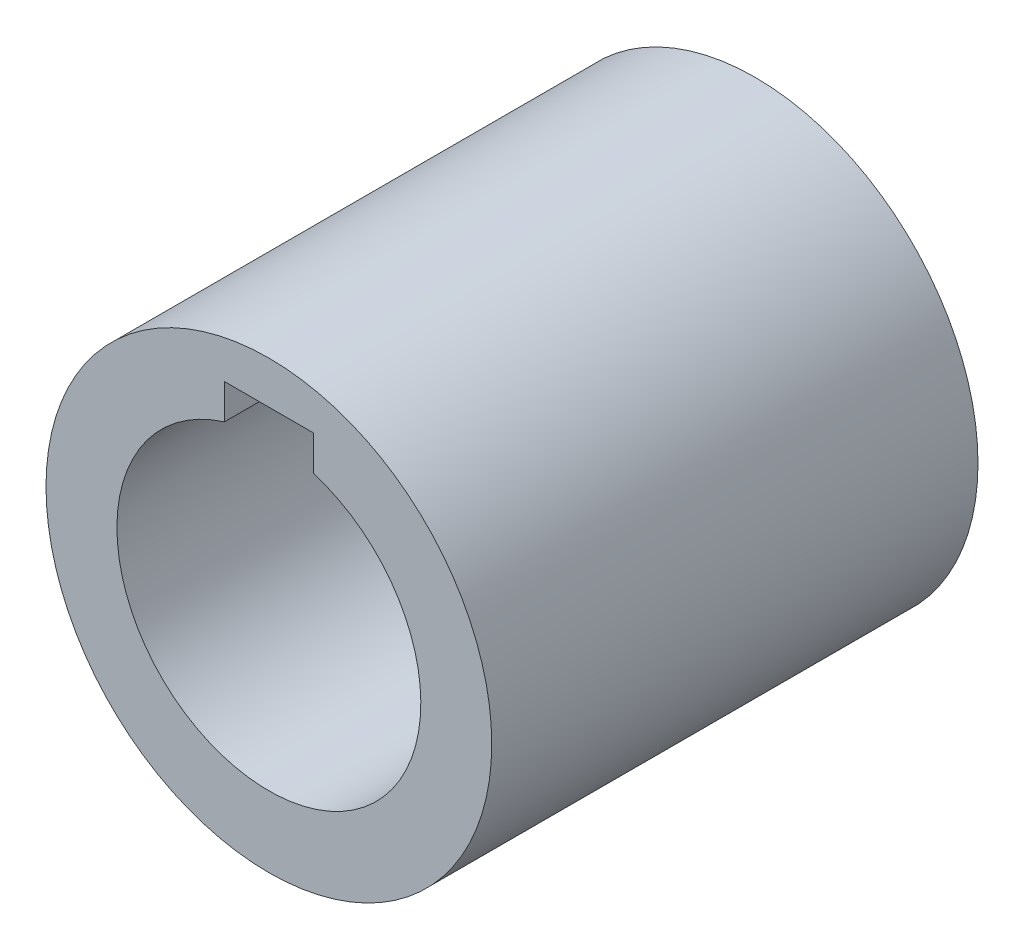
ISO-10303-21;
HEADER;
FILE_DESCRIPTION(('STEP AP214'),'2;1');
FILE_NAME('part.step','',(''),(''),'','','');
FILE_SCHEMA(('AUTOMOTIVE_DESIGN { 1 0 10303 214 1 1 1 1 }'));
ENDSEC;
DATA;
#1=APPLICATION_CONTEXT('core data for automotive mechanical design processes');
#2=APPLICATION_PROTOCOL_DEFINITION('international standard','automotive_design',2000,#1);
#3=PRODUCT_CONTEXT('',#1,'mechanical');
#4=PRODUCT('Part','Part','',(#3));
#5=PRODUCT_RELATED_PRODUCT_CATEGORY('part','',(#4));
#6=PRODUCT_DEFINITION_FORMATION('','',#4);
#7=PRODUCT_DEFINITION_CONTEXT('part definition',#1,'design');
#8=PRODUCT_DEFINITION('design','',#6,#7);
#9=PRODUCT_DEFINITION_SHAPE('','',#8);
#10=(LENGTH_UNIT() NAMED_UNIT(*) SI_UNIT(.MILLI.,.METRE.));
#11=(NAMED_UNIT(*) PLANE_ANGLE_UNIT() SI_UNIT($,.RADIAN.));
#12=(NAMED_UNIT(*) SI_UNIT($,.STERADIAN.) SOLID_ANGLE_UNIT());
#13=UNCERTAINTY_MEASURE_WITH_UNIT(LENGTH_MEASURE(1.E-05),#10,'distance_accuracy_value','');
#14=(GEOMETRIC_REPRESENTATION_CONTEXT(3) GLOBAL_UNCERTAINTY_ASSIGNED_CONTEXT((#13)) GLOBAL_UNIT_ASSIGNED_CONTEXT((#10,
#11,#12)) REPRESENTATION_CONTEXT('',''));
#15=CARTESIAN_POINT('',(0.,0.,0.));
#16=DIRECTION('',(0.,0.,1.));
#17=DIRECTION('',(1.,0.,0.));
#18=AXIS2_PLACEMENT_3D('',#15,#16,#17);
#19=CARTESIAN_POINT('',(0.,0.,120.));
#20=DIRECTION('',(0.,0.,1.));
#21=DIRECTION('',(1.,0.,0.));
#22=AXIS2_PLACEMENT_3D('',#19,#20,#21);
#23=PLANE('',#22);
#24=DIRECTION('',(0.,1.,0.));
#25=VECTOR('',#24,1.);
#26=CARTESIAN_POINT('',(11.,0.,120.));
#27=LINE('',#26,#25);
#28=CARTESIAN_POINT('',(11.,35.8503835404867,120.));
#29=VERTEX_POINT('',#28);
#30=CARTESIAN_POINT('',(11.,44.5,120.));
#31=VERTEX_POINT('',#30);
#32=EDGE_CURVE('E76',#29,#31,#27,.T.);
#33=ORIENTED_EDGE('',*,*,#32,.F.);
#34=CARTESIAN_POINT('',(0.,0.,120.));
#35=DIRECTION('',(0.,0.,1.));
#36=DIRECTION('',(1.,0.,0.));
#37=AXIS2_PLACEMENT_3D('',#34,#35,#36);
#38=CIRCLE('',#37,37.5);
#39=CARTESIAN_POINT('',(-11.,35.8503835404867,120.));
#40=VERTEX_POINT('',#39);
#41=EDGE_CURVE('E102',#40,#29,#38,.T.);
#42=ORIENTED_EDGE('',*,*,#41,.F.);
#43=DIRECTION('',(0.,-1.,0.));
#44=VECTOR('',#43,1.);
#45=CARTESIAN_POINT('',(-11.,0.,120.));
#46=LINE('',#45,#44);
#47=CARTESIAN_POINT('',(-11.,44.5,120.));
#48=VERTEX_POINT('',#47);
#49=EDGE_CURVE('E48',#48,#40,#46,.T.);
#50=ORIENTED_EDGE('',*,*,#49,.F.);
#51=DIRECTION('',(-1.,0.,0.));
#52=VECTOR('',#51,1.);
#53=CARTESIAN_POINT('',(0.,44.5,120.));
#54=LINE('',#53,#52);
#55=EDGE_CURVE('E100',#31,#48,#54,.T.);
#56=ORIENTED_EDGE('',*,*,#55,.F.);
#57=EDGE_LOOP('',(#33,#42,#50,#56));
#58=FACE_BOUND('',#57,.T.);
#59=CARTESIAN_POINT('',(0.,0.,120.));
#60=DIRECTION('',(0.,0.,1.));
#61=DIRECTION('',(1.,0.,0.));
#62=AXIS2_PLACEMENT_3D('',#59,#60,#61);
#63=CIRCLE('',#62,55.);
#64=CARTESIAN_POINT('',(55.,0.,120.));
#65=VERTEX_POINT('',#64);
#66=EDGE_CURVE('E107',#65,#65,#63,.T.);
#67=ORIENTED_EDGE('',*,*,#66,.T.);
#68=EDGE_LOOP('',(#67));
#69=FACE_BOUND('',#68,.T.);
#70=ADVANCED_FACE('F33',(#58,#69),#23,.T.);
#71=CARTESIAN_POINT('',(0.,0.,0.));
#72=DIRECTION('',(0.,0.,1.));
#73=DIRECTION('',(1.,0.,0.));
#74=AXIS2_PLACEMENT_3D('',#71,#72,#73);
#75=PLANE('',#74);
#76=CARTESIAN_POINT('',(0.,0.,0.));
#77=DIRECTION('',(0.,0.,1.));
#78=DIRECTION('',(1.,0.,0.));
#79=AXIS2_PLACEMENT_3D('',#76,#77,#78);
#80=CIRCLE('',#79,37.5);
#81=CARTESIAN_POINT('',(-11.,35.8503835404867,0.));
#82=VERTEX_POINT('',#81);
#83=CARTESIAN_POINT('',(11.,35.8503835404867,0.));
#84=VERTEX_POINT('',#83);
#85=EDGE_CURVE('E93',#82,#84,#80,.T.);
#86=ORIENTED_EDGE('',*,*,#85,.T.);
#87=DIRECTION('',(0.,1.,0.));
#88=VECTOR('',#87,1.);
#89=CARTESIAN_POINT('',(11.,30.5,0.));
#90=LINE('',#89,#88);
#91=CARTESIAN_POINT('',(11.,44.5,0.));
#92=VERTEX_POINT('',#91);
#93=EDGE_CURVE('E75',#84,#92,#90,.T.);
#94=ORIENTED_EDGE('',*,*,#93,.T.);
#95=DIRECTION('',(-1.,0.,0.));
#96=VECTOR('',#95,1.);
#97=CARTESIAN_POINT('',(-11.,44.5,0.));
#98=LINE('',#97,#96);
#99=CARTESIAN_POINT('',(-11.,44.5,0.));
#100=VERTEX_POINT('',#99);
#101=EDGE_CURVE('E83',#92,#100,#98,.T.);
#102=ORIENTED_EDGE('',*,*,#101,.T.);
#103=DIRECTION('',(0.,-1.,0.));
#104=VECTOR('',#103,1.);
#105=CARTESIAN_POINT('',(-11.,30.5,0.));
#106=LINE('',#105,#104);
#107=EDGE_CURVE('E80',#100,#82,#106,.T.);
#108=ORIENTED_EDGE('',*,*,#107,.T.);
#109=EDGE_LOOP('',(#86,#94,#102,#108));
#110=FACE_BOUND('',#109,.T.);
#111=CARTESIAN_POINT('',(0.,0.,0.));
#112=DIRECTION('',(0.,0.,1.));
#113=DIRECTION('',(1.,0.,0.));
#114=AXIS2_PLACEMENT_3D('',#111,#112,#113);
#115=CIRCLE('',#114,55.);
#116=CARTESIAN_POINT('',(55.,0.,0.));
#117=VERTEX_POINT('',#116);
#118=EDGE_CURVE('E105',#117,#117,#115,.T.);
#119=ORIENTED_EDGE('',*,*,#118,.F.);
#120=EDGE_LOOP('',(#119));
#121=FACE_BOUND('',#120,.T.);
#122=ADVANCED_FACE('F90',(#110,#121),#75,.F.);
#123=CARTESIAN_POINT('',(0.,0.,120.));
#124=DIRECTION('',(0.,0.,-1.));
#125=DIRECTION('',(-1.,0.,0.));
#126=AXIS2_PLACEMENT_3D('',#123,#124,#125);
#127=CYLINDRICAL_SURFACE('',#126,55.);
#128=ORIENTED_EDGE('',*,*,#66,.F.);
#129=EDGE_LOOP('',(#128));
#130=FACE_BOUND('',#129,.T.);
#131=ORIENTED_EDGE('',*,*,#118,.T.);
#132=EDGE_LOOP('',(#131));
#133=FACE_BOUND('',#132,.T.);
#134=ADVANCED_FACE('F35',(#130,#133),#127,.T.);
#135=CARTESIAN_POINT('',(0.,0.,120.));
#136=DIRECTION('',(0.,0.,-1.));
#137=DIRECTION('',(-1.,0.,0.));
#138=AXIS2_PLACEMENT_3D('',#135,#136,#137);
#139=CYLINDRICAL_SURFACE('',#138,37.5);
#140=DIRECTION('',(0.,0.,-1.));
#141=VECTOR('',#140,1.);
#142=CARTESIAN_POINT('',(11.,35.8503835404867,120.));
#143=LINE('',#142,#141);
#144=EDGE_CURVE('E11',#84,#29,#143,.F.);
#145=ORIENTED_EDGE('',*,*,#144,.F.);
#146=ORIENTED_EDGE('',*,*,#85,.F.);
#147=DIRECTION('',(0.,0.,-1.));
#148=VECTOR('',#147,1.);
#149=CARTESIAN_POINT('',(-11.,35.8503835404867,120.));
#150=LINE('',#149,#148);
#151=EDGE_CURVE('E41',#40,#82,#150,.T.);
#152=ORIENTED_EDGE('',*,*,#151,.F.);
#153=ORIENTED_EDGE('',*,*,#41,.T.);
#154=EDGE_LOOP('',(#145,#146,#152,#153));
#155=FACE_BOUND('',#154,.T.);
#156=ADVANCED_FACE('F114',(#155),#139,.F.);
#157=CARTESIAN_POINT('',(11.,30.5,0.));
#158=DIRECTION('',(1.,0.,0.));
#159=DIRECTION('',(0.,0.,-1.));
#160=AXIS2_PLACEMENT_3D('',#157,#158,#159);
#161=PLANE('',#160);
#162=ORIENTED_EDGE('',*,*,#32,.T.);
#163=DIRECTION('',(0.,0.,1.));
#164=VECTOR('',#163,1.);
#165=CARTESIAN_POINT('',(11.,44.5,0.));
#166=LINE('',#165,#164);
#167=EDGE_CURVE('E71',#92,#31,#166,.T.);
#168=ORIENTED_EDGE('',*,*,#167,.F.);
#169=ORIENTED_EDGE('',*,*,#93,.F.);
#170=ORIENTED_EDGE('',*,*,#144,.T.);
#171=EDGE_LOOP('',(#162,#168,#169,#170));
#172=FACE_BOUND('',#171,.T.);
#173=ADVANCED_FACE('F73',(#172),#161,.F.);
#174=CARTESIAN_POINT('',(-11.,30.5,0.));
#175=DIRECTION('',(-1.,0.,0.));
#176=DIRECTION('',(0.,0.,1.));
#177=AXIS2_PLACEMENT_3D('',#174,#175,#176);
#178=PLANE('',#177);
#179=ORIENTED_EDGE('',*,*,#49,.T.);
#180=ORIENTED_EDGE('',*,*,#151,.T.);
#181=ORIENTED_EDGE('',*,*,#107,.F.);
#182=DIRECTION('',(0.,0.,1.));
#183=VECTOR('',#182,1.);
#184=CARTESIAN_POINT('',(-11.,44.5,0.));
#185=LINE('',#184,#183);
#186=EDGE_CURVE('E79',#100,#48,#185,.T.);
#187=ORIENTED_EDGE('',*,*,#186,.T.);
#188=EDGE_LOOP('',(#179,#180,#181,#187));
#189=FACE_BOUND('',#188,.T.);
#190=ADVANCED_FACE('F111',(#189),#178,.F.);
#191=CARTESIAN_POINT('',(-11.,44.5,0.));
#192=DIRECTION('',(0.,1.,0.));
#193=DIRECTION('',(0.,0.,1.));
#194=AXIS2_PLACEMENT_3D('',#191,#192,#193);
#195=PLANE('',#194);
#196=ORIENTED_EDGE('',*,*,#55,.T.);
#197=ORIENTED_EDGE('',*,*,#186,.F.);
#198=ORIENTED_EDGE('',*,*,#101,.F.);
#199=ORIENTED_EDGE('',*,*,#167,.T.);
#200=EDGE_LOOP('',(#196,#197,#198,#199));
#201=FACE_BOUND('',#200,.T.);
#202=ADVANCED_FACE('F84',(#201),#195,.F.);
#203=CLOSED_SHELL('',(#70,#122,#134,#156,#173,#190,#202));
#204=MANIFOLD_SOLID_BREP('B2',#203);
#205=ADVANCED_BREP_SHAPE_REPRESENTATION('',(#18,#204),#14);
#206=SHAPE_DEFINITION_REPRESENTATION(#9,#205);
ENDSEC;
END-ISO-10303-21;
